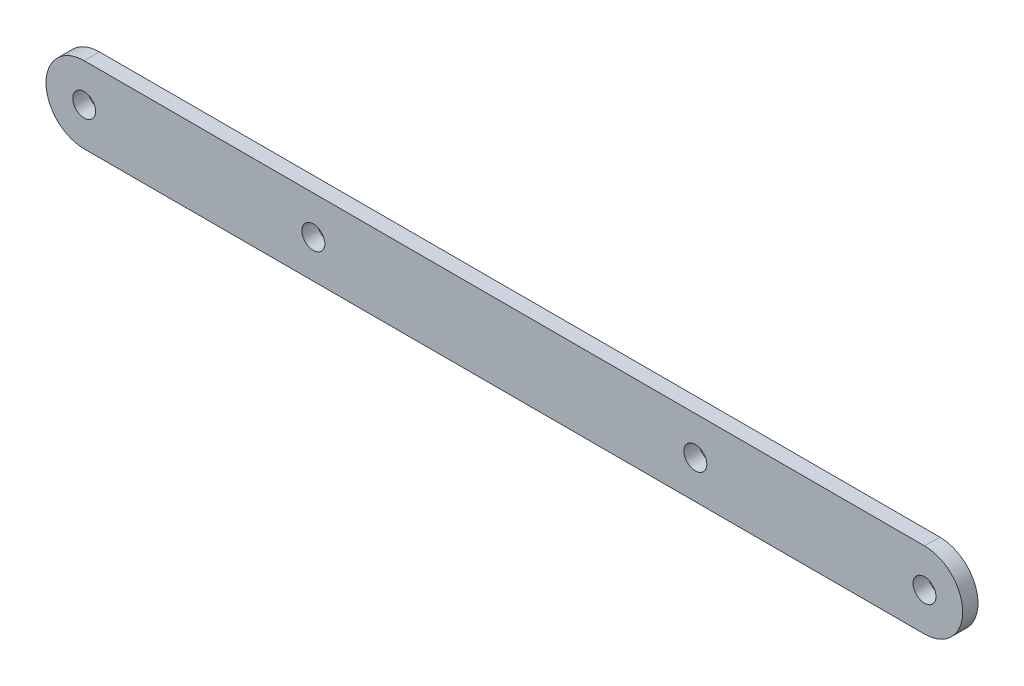
ISO-10303-21;
HEADER;
FILE_DESCRIPTION(('STEP AP214'),'2;1');
FILE_NAME('part.step','',(''),(''),'','','');
FILE_SCHEMA(('AUTOMOTIVE_DESIGN { 1 0 10303 214 1 1 1 1 }'));
ENDSEC;
DATA;
#1=APPLICATION_CONTEXT('core data for automotive mechanical design processes');
#2=APPLICATION_PROTOCOL_DEFINITION('international standard','automotive_design',2000,#1);
#3=PRODUCT_CONTEXT('',#1,'mechanical');
#4=PRODUCT('Part','Part','',(#3));
#5=PRODUCT_RELATED_PRODUCT_CATEGORY('part','',(#4));
#6=PRODUCT_DEFINITION_FORMATION('','',#4);
#7=PRODUCT_DEFINITION_CONTEXT('part definition',#1,'design');
#8=PRODUCT_DEFINITION('design','',#6,#7);
#9=PRODUCT_DEFINITION_SHAPE('','',#8);
#10=(LENGTH_UNIT() NAMED_UNIT(*) SI_UNIT(.MILLI.,.METRE.));
#11=(NAMED_UNIT(*) PLANE_ANGLE_UNIT() SI_UNIT($,.RADIAN.));
#12=(NAMED_UNIT(*) SI_UNIT($,.STERADIAN.) SOLID_ANGLE_UNIT());
#13=UNCERTAINTY_MEASURE_WITH_UNIT(LENGTH_MEASURE(1.E-05),#10,'distance_accuracy_value','');
#14=(GEOMETRIC_REPRESENTATION_CONTEXT(3) GLOBAL_UNCERTAINTY_ASSIGNED_CONTEXT((#13)) GLOBAL_UNIT_ASSIGNED_CONTEXT((#10,
#11,#12)) REPRESENTATION_CONTEXT('',''));
#15=CARTESIAN_POINT('',(0.,0.,0.));
#16=DIRECTION('',(0.,0.,1.));
#17=DIRECTION('',(1.,0.,0.));
#18=AXIS2_PLACEMENT_3D('',#15,#16,#17);
#19=CARTESIAN_POINT('',(0.,-30.,2.));
#20=DIRECTION('',(0.,0.,1.));
#21=DIRECTION('',(1.,0.,0.));
#22=AXIS2_PLACEMENT_3D('',#19,#20,#21);
#23=PLANE('',#22);
#24=CARTESIAN_POINT('',(-55.,-30.,2.));
#25=DIRECTION('',(0.,0.,1.));
#26=DIRECTION('',(1.,0.,0.));
#27=AXIS2_PLACEMENT_3D('',#24,#25,#26);
#28=CIRCLE('',#27,1.5);
#29=CARTESIAN_POINT('',(-53.5,-30.,2.));
#30=VERTEX_POINT('',#29);
#31=EDGE_CURVE('E25',#30,#30,#28,.T.);
#32=ORIENTED_EDGE('',*,*,#31,.F.);
#33=EDGE_LOOP('',(#32));
#34=FACE_BOUND('',#33,.T.);
#35=CARTESIAN_POINT('',(-25.,-30.,2.));
#36=DIRECTION('',(0.,0.,1.));
#37=DIRECTION('',(1.,0.,0.));
#38=AXIS2_PLACEMENT_3D('',#35,#36,#37);
#39=CIRCLE('',#38,1.5);
#40=CARTESIAN_POINT('',(-23.5,-30.,2.));
#41=VERTEX_POINT('',#40);
#42=EDGE_CURVE('E152',#41,#41,#39,.T.);
#43=ORIENTED_EDGE('',*,*,#42,.F.);
#44=EDGE_LOOP('',(#43));
#45=FACE_BOUND('',#44,.T.);
#46=CARTESIAN_POINT('',(25.,-30.,2.));
#47=DIRECTION('',(0.,0.,1.));
#48=DIRECTION('',(1.,0.,0.));
#49=AXIS2_PLACEMENT_3D('',#46,#47,#48);
#50=CIRCLE('',#49,1.5);
#51=CARTESIAN_POINT('',(26.5,-30.,2.));
#52=VERTEX_POINT('',#51);
#53=EDGE_CURVE('E172',#52,#52,#50,.T.);
#54=ORIENTED_EDGE('',*,*,#53,.F.);
#55=EDGE_LOOP('',(#54));
#56=FACE_BOUND('',#55,.T.);
#57=CARTESIAN_POINT('',(55.,-30.,2.));
#58=DIRECTION('',(0.,0.,1.));
#59=DIRECTION('',(1.,0.,0.));
#60=AXIS2_PLACEMENT_3D('',#57,#58,#59);
#61=CIRCLE('',#60,1.5);
#62=CARTESIAN_POINT('',(56.5,-30.,2.));
#63=VERTEX_POINT('',#62);
#64=EDGE_CURVE('E145',#63,#63,#61,.T.);
#65=ORIENTED_EDGE('',*,*,#64,.F.);
#66=EDGE_LOOP('',(#65));
#67=FACE_BOUND('',#66,.T.);
#68=CARTESIAN_POINT('',(-55.,-30.,2.));
#69=DIRECTION('',(0.,0.,1.));
#70=DIRECTION('',(1.,0.,0.));
#71=AXIS2_PLACEMENT_3D('',#68,#69,#70);
#72=CIRCLE('',#71,5.);
#73=CARTESIAN_POINT('',(-55.,-25.,2.));
#74=VERTEX_POINT('',#73);
#75=CARTESIAN_POINT('',(-55.,-35.,2.));
#76=VERTEX_POINT('',#75);
#77=EDGE_CURVE('E137',#74,#76,#72,.T.);
#78=ORIENTED_EDGE('',*,*,#77,.T.);
#79=DIRECTION('',(1.,0.,0.));
#80=VECTOR('',#79,1.);
#81=CARTESIAN_POINT('',(-55.,-35.,2.));
#82=LINE('',#81,#80);
#83=CARTESIAN_POINT('',(55.,-35.,2.));
#84=VERTEX_POINT('',#83);
#85=EDGE_CURVE('E118',#76,#84,#82,.T.);
#86=ORIENTED_EDGE('',*,*,#85,.T.);
#87=CARTESIAN_POINT('',(55.,-30.,2.));
#88=DIRECTION('',(0.,0.,1.));
#89=DIRECTION('',(1.,0.,0.));
#90=AXIS2_PLACEMENT_3D('',#87,#88,#89);
#91=CIRCLE('',#90,5.);
#92=CARTESIAN_POINT('',(55.,-25.,2.));
#93=VERTEX_POINT('',#92);
#94=EDGE_CURVE('E90',#84,#93,#91,.T.);
#95=ORIENTED_EDGE('',*,*,#94,.T.);
#96=DIRECTION('',(-1.,0.,0.));
#97=VECTOR('',#96,1.);
#98=CARTESIAN_POINT('',(55.,-25.,2.));
#99=LINE('',#98,#97);
#100=EDGE_CURVE('E18',#93,#74,#99,.T.);
#101=ORIENTED_EDGE('',*,*,#100,.T.);
#102=EDGE_LOOP('',(#78,#86,#95,#101));
#103=FACE_BOUND('',#102,.T.);
#104=ADVANCED_FACE('F14',(#34,#45,#56,#67,#103),#23,.T.);
#105=CARTESIAN_POINT('',(0.,-30.,0.));
#106=DIRECTION('',(0.,0.,1.));
#107=DIRECTION('',(1.,0.,0.));
#108=AXIS2_PLACEMENT_3D('',#105,#106,#107);
#109=PLANE('',#108);
#110=CARTESIAN_POINT('',(-55.,-30.,0.));
#111=DIRECTION('',(0.,0.,1.));
#112=DIRECTION('',(1.,0.,0.));
#113=AXIS2_PLACEMENT_3D('',#110,#111,#112);
#114=CIRCLE('',#113,1.5);
#115=CARTESIAN_POINT('',(-53.5,-30.,0.));
#116=VERTEX_POINT('',#115);
#117=EDGE_CURVE('E9',#116,#116,#114,.T.);
#118=ORIENTED_EDGE('',*,*,#117,.T.);
#119=EDGE_LOOP('',(#118));
#120=FACE_BOUND('',#119,.T.);
#121=CARTESIAN_POINT('',(-25.,-30.,0.));
#122=DIRECTION('',(0.,0.,1.));
#123=DIRECTION('',(1.,0.,0.));
#124=AXIS2_PLACEMENT_3D('',#121,#122,#123);
#125=CIRCLE('',#124,1.5);
#126=CARTESIAN_POINT('',(-23.5,-30.,0.));
#127=VERTEX_POINT('',#126);
#128=EDGE_CURVE('E156',#127,#127,#125,.T.);
#129=ORIENTED_EDGE('',*,*,#128,.T.);
#130=EDGE_LOOP('',(#129));
#131=FACE_BOUND('',#130,.T.);
#132=CARTESIAN_POINT('',(25.,-30.,0.));
#133=DIRECTION('',(0.,0.,1.));
#134=DIRECTION('',(1.,0.,0.));
#135=AXIS2_PLACEMENT_3D('',#132,#133,#134);
#136=CIRCLE('',#135,1.5);
#137=CARTESIAN_POINT('',(26.5,-30.,0.));
#138=VERTEX_POINT('',#137);
#139=EDGE_CURVE('E153',#138,#138,#136,.T.);
#140=ORIENTED_EDGE('',*,*,#139,.T.);
#141=EDGE_LOOP('',(#140));
#142=FACE_BOUND('',#141,.T.);
#143=CARTESIAN_POINT('',(55.,-30.,0.));
#144=DIRECTION('',(0.,0.,1.));
#145=DIRECTION('',(1.,0.,0.));
#146=AXIS2_PLACEMENT_3D('',#143,#144,#145);
#147=CIRCLE('',#146,1.5);
#148=CARTESIAN_POINT('',(56.5,-30.,0.));
#149=VERTEX_POINT('',#148);
#150=EDGE_CURVE('E141',#149,#149,#147,.T.);
#151=ORIENTED_EDGE('',*,*,#150,.T.);
#152=EDGE_LOOP('',(#151));
#153=FACE_BOUND('',#152,.T.);
#154=DIRECTION('',(-1.,0.,0.));
#155=VECTOR('',#154,1.);
#156=CARTESIAN_POINT('',(55.,-25.,0.));
#157=LINE('',#156,#155);
#158=CARTESIAN_POINT('',(55.,-25.,0.));
#159=VERTEX_POINT('',#158);
#160=CARTESIAN_POINT('',(-55.,-25.,0.));
#161=VERTEX_POINT('',#160);
#162=EDGE_CURVE('E117',#159,#161,#157,.T.);
#163=ORIENTED_EDGE('',*,*,#162,.F.);
#164=CARTESIAN_POINT('',(55.,-30.,0.));
#165=DIRECTION('',(0.,0.,1.));
#166=DIRECTION('',(1.,0.,0.));
#167=AXIS2_PLACEMENT_3D('',#164,#165,#166);
#168=CIRCLE('',#167,5.);
#169=CARTESIAN_POINT('',(55.,-35.,0.));
#170=VERTEX_POINT('',#169);
#171=EDGE_CURVE('E101',#170,#159,#168,.T.);
#172=ORIENTED_EDGE('',*,*,#171,.F.);
#173=DIRECTION('',(1.,0.,0.));
#174=VECTOR('',#173,1.);
#175=CARTESIAN_POINT('',(-55.,-35.,0.));
#176=LINE('',#175,#174);
#177=CARTESIAN_POINT('',(-55.,-35.,0.));
#178=VERTEX_POINT('',#177);
#179=EDGE_CURVE('E176',#178,#170,#176,.T.);
#180=ORIENTED_EDGE('',*,*,#179,.F.);
#181=CARTESIAN_POINT('',(-55.,-30.,0.));
#182=DIRECTION('',(0.,0.,1.));
#183=DIRECTION('',(1.,0.,0.));
#184=AXIS2_PLACEMENT_3D('',#181,#182,#183);
#185=CIRCLE('',#184,5.);
#186=EDGE_CURVE('E138',#161,#178,#185,.T.);
#187=ORIENTED_EDGE('',*,*,#186,.F.);
#188=EDGE_LOOP('',(#163,#172,#180,#187));
#189=FACE_BOUND('',#188,.T.);
#190=ADVANCED_FACE('F190',(#120,#131,#142,#153,#189),#109,.F.);
#191=CARTESIAN_POINT('',(-55.,-30.,0.));
#192=DIRECTION('',(0.,0.,-1.));
#193=DIRECTION('',(1.,0.,0.));
#194=AXIS2_PLACEMENT_3D('',#191,#192,#193);
#195=CYLINDRICAL_SURFACE('',#194,1.5);
#196=DIRECTION('',(0.,0.,1.));
#197=VECTOR('',#196,1.);
#198=CARTESIAN_POINT('',(-53.5,-30.,0.));
#199=LINE('',#198,#197);
#200=EDGE_CURVE('E157',#116,#30,#199,.T.);
#201=ORIENTED_EDGE('',*,*,#200,.T.);
#202=ORIENTED_EDGE('',*,*,#31,.T.);
#203=ORIENTED_EDGE('',*,*,#200,.F.);
#204=ORIENTED_EDGE('',*,*,#117,.F.);
#205=EDGE_LOOP('',(#201,#202,#203,#204));
#206=FACE_BOUND('',#205,.T.);
#207=ADVANCED_FACE('F16',(#206),#195,.F.);
#208=CARTESIAN_POINT('',(-25.,-30.,0.));
#209=DIRECTION('',(0.,0.,-1.));
#210=DIRECTION('',(1.,0.,0.));
#211=AXIS2_PLACEMENT_3D('',#208,#209,#210);
#212=CYLINDRICAL_SURFACE('',#211,1.5);
#213=DIRECTION('',(0.,0.,1.));
#214=VECTOR('',#213,1.);
#215=CARTESIAN_POINT('',(-23.5,-30.,0.));
#216=LINE('',#215,#214);
#217=EDGE_CURVE('E148',#127,#41,#216,.T.);
#218=ORIENTED_EDGE('',*,*,#217,.T.);
#219=ORIENTED_EDGE('',*,*,#42,.T.);
#220=ORIENTED_EDGE('',*,*,#217,.F.);
#221=ORIENTED_EDGE('',*,*,#128,.F.);
#222=EDGE_LOOP('',(#218,#219,#220,#221));
#223=FACE_BOUND('',#222,.T.);
#224=ADVANCED_FACE('F215',(#223),#212,.F.);
#225=CARTESIAN_POINT('',(25.,-30.,0.));
#226=DIRECTION('',(0.,0.,-1.));
#227=DIRECTION('',(1.,0.,0.));
#228=AXIS2_PLACEMENT_3D('',#225,#226,#227);
#229=CYLINDRICAL_SURFACE('',#228,1.5);
#230=DIRECTION('',(0.,0.,1.));
#231=VECTOR('',#230,1.);
#232=CARTESIAN_POINT('',(26.5,-30.,0.));
#233=LINE('',#232,#231);
#234=EDGE_CURVE('E144',#138,#52,#233,.T.);
#235=ORIENTED_EDGE('',*,*,#234,.T.);
#236=ORIENTED_EDGE('',*,*,#53,.T.);
#237=ORIENTED_EDGE('',*,*,#234,.F.);
#238=ORIENTED_EDGE('',*,*,#139,.F.);
#239=EDGE_LOOP('',(#235,#236,#237,#238));
#240=FACE_BOUND('',#239,.T.);
#241=ADVANCED_FACE('F227',(#240),#229,.F.);
#242=CARTESIAN_POINT('',(55.,-30.,0.));
#243=DIRECTION('',(0.,0.,-1.));
#244=DIRECTION('',(1.,0.,0.));
#245=AXIS2_PLACEMENT_3D('',#242,#243,#244);
#246=CYLINDRICAL_SURFACE('',#245,1.5);
#247=DIRECTION('',(0.,0.,1.));
#248=VECTOR('',#247,1.);
#249=CARTESIAN_POINT('',(56.5,-30.,0.));
#250=LINE('',#249,#248);
#251=EDGE_CURVE('E116',#149,#63,#250,.T.);
#252=ORIENTED_EDGE('',*,*,#251,.T.);
#253=ORIENTED_EDGE('',*,*,#64,.T.);
#254=ORIENTED_EDGE('',*,*,#251,.F.);
#255=ORIENTED_EDGE('',*,*,#150,.F.);
#256=EDGE_LOOP('',(#252,#253,#254,#255));
#257=FACE_BOUND('',#256,.T.);
#258=ADVANCED_FACE('F187',(#257),#246,.F.);
#259=CARTESIAN_POINT('',(55.,-25.,0.));
#260=DIRECTION('',(0.,-1.,0.));
#261=DIRECTION('',(0.,0.,-1.));
#262=AXIS2_PLACEMENT_3D('',#259,#260,#261);
#263=PLANE('',#262);
#264=ORIENTED_EDGE('',*,*,#162,.T.);
#265=DIRECTION('',(0.,0.,1.));
#266=VECTOR('',#265,1.);
#267=CARTESIAN_POINT('',(-55.,-25.,0.));
#268=LINE('',#267,#266);
#269=EDGE_CURVE('E111',#161,#74,#268,.T.);
#270=ORIENTED_EDGE('',*,*,#269,.T.);
#271=ORIENTED_EDGE('',*,*,#100,.F.);
#272=DIRECTION('',(0.,0.,1.));
#273=VECTOR('',#272,1.);
#274=CARTESIAN_POINT('',(55.,-25.,0.));
#275=LINE('',#274,#273);
#276=EDGE_CURVE('E109',#159,#93,#275,.T.);
#277=ORIENTED_EDGE('',*,*,#276,.F.);
#278=EDGE_LOOP('',(#264,#270,#271,#277));
#279=FACE_BOUND('',#278,.T.);
#280=ADVANCED_FACE('F108',(#279),#263,.F.);
#281=CARTESIAN_POINT('',(55.,-30.,0.));
#282=DIRECTION('',(0.,0.,-1.));
#283=DIRECTION('',(1.,0.,0.));
#284=AXIS2_PLACEMENT_3D('',#281,#282,#283);
#285=CYLINDRICAL_SURFACE('',#284,5.);
#286=ORIENTED_EDGE('',*,*,#171,.T.);
#287=ORIENTED_EDGE('',*,*,#276,.T.);
#288=ORIENTED_EDGE('',*,*,#94,.F.);
#289=DIRECTION('',(0.,0.,1.));
#290=VECTOR('',#289,1.);
#291=CARTESIAN_POINT('',(55.,-35.,0.));
#292=LINE('',#291,#290);
#293=EDGE_CURVE('E167',#170,#84,#292,.T.);
#294=ORIENTED_EDGE('',*,*,#293,.F.);
#295=EDGE_LOOP('',(#286,#287,#288,#294));
#296=FACE_BOUND('',#295,.T.);
#297=ADVANCED_FACE('F122',(#296),#285,.T.);
#298=CARTESIAN_POINT('',(-55.,-35.,0.));
#299=DIRECTION('',(0.,1.,0.));
#300=DIRECTION('',(1.,0.,0.));
#301=AXIS2_PLACEMENT_3D('',#298,#299,#300);
#302=PLANE('',#301);
#303=ORIENTED_EDGE('',*,*,#179,.T.);
#304=ORIENTED_EDGE('',*,*,#293,.T.);
#305=ORIENTED_EDGE('',*,*,#85,.F.);
#306=DIRECTION('',(0.,0.,1.));
#307=VECTOR('',#306,1.);
#308=CARTESIAN_POINT('',(-55.,-35.,0.));
#309=LINE('',#308,#307);
#310=EDGE_CURVE('E133',#178,#76,#309,.T.);
#311=ORIENTED_EDGE('',*,*,#310,.F.);
#312=EDGE_LOOP('',(#303,#304,#305,#311));
#313=FACE_BOUND('',#312,.T.);
#314=ADVANCED_FACE('F239',(#313),#302,.F.);
#315=CARTESIAN_POINT('',(-55.,-30.,0.));
#316=DIRECTION('',(0.,0.,-1.));
#317=DIRECTION('',(1.,0.,0.));
#318=AXIS2_PLACEMENT_3D('',#315,#316,#317);
#319=CYLINDRICAL_SURFACE('',#318,5.);
#320=ORIENTED_EDGE('',*,*,#186,.T.);
#321=ORIENTED_EDGE('',*,*,#310,.T.);
#322=ORIENTED_EDGE('',*,*,#77,.F.);
#323=ORIENTED_EDGE('',*,*,#269,.F.);
#324=EDGE_LOOP('',(#320,#321,#322,#323));
#325=FACE_BOUND('',#324,.T.);
#326=ADVANCED_FACE('F196',(#325),#319,.T.);
#327=CLOSED_SHELL('',(#104,#190,#207,#224,#241,#258,#280,#297,#314,#326));
#328=MANIFOLD_SOLID_BREP('B1',#327);
#329=ADVANCED_BREP_SHAPE_REPRESENTATION('',(#18,#328),#14);
#330=SHAPE_DEFINITION_REPRESENTATION(#9,#329);
ENDSEC;
END-ISO-10303-21;
